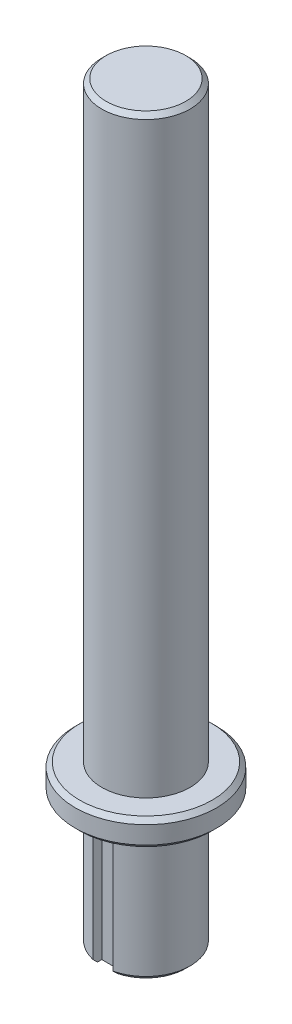
ISO-10303-21;
HEADER;
FILE_DESCRIPTION(('STEP AP214'),'2;1');
FILE_NAME('part.step','',(''),(''),'','','');
FILE_SCHEMA(('AUTOMOTIVE_DESIGN { 1 0 10303 214 1 1 1 1 }'));
ENDSEC;
DATA;
#1=APPLICATION_CONTEXT('core data for automotive mechanical design processes');
#2=APPLICATION_PROTOCOL_DEFINITION('international standard','automotive_design',2000,#1);
#3=PRODUCT_CONTEXT('',#1,'mechanical');
#4=PRODUCT('Part','Part','',(#3));
#5=PRODUCT_RELATED_PRODUCT_CATEGORY('part','',(#4));
#6=PRODUCT_DEFINITION_FORMATION('','',#4);
#7=PRODUCT_DEFINITION_CONTEXT('part definition',#1,'design');
#8=PRODUCT_DEFINITION('design','',#6,#7);
#9=PRODUCT_DEFINITION_SHAPE('','',#8);
#10=(LENGTH_UNIT() NAMED_UNIT(*) SI_UNIT(.MILLI.,.METRE.));
#11=(NAMED_UNIT(*) PLANE_ANGLE_UNIT() SI_UNIT($,.RADIAN.));
#12=(NAMED_UNIT(*) SI_UNIT($,.STERADIAN.) SOLID_ANGLE_UNIT());
#13=UNCERTAINTY_MEASURE_WITH_UNIT(LENGTH_MEASURE(1.E-05),#10,'distance_accuracy_value','');
#14=(GEOMETRIC_REPRESENTATION_CONTEXT(3) GLOBAL_UNCERTAINTY_ASSIGNED_CONTEXT((#13)) GLOBAL_UNIT_ASSIGNED_CONTEXT((#10,
#11,#12)) REPRESENTATION_CONTEXT('',''));
#15=CARTESIAN_POINT('',(0.,0.,0.));
#16=DIRECTION('',(0.,0.,1.));
#17=DIRECTION('',(1.,0.,0.));
#18=AXIS2_PLACEMENT_3D('',#15,#16,#17);
#19=CARTESIAN_POINT('',(0.,0.,0.));
#20=DIRECTION('',(0.,1.,0.));
#21=DIRECTION('',(-1.,0.,0.));
#22=AXIS2_PLACEMENT_3D('',#19,#20,#21);
#23=PLANE('',#22);
#24=DIRECTION('',(0.,0.,-1.));
#25=VECTOR('',#24,1.);
#26=CARTESIAN_POINT('',(-1.125,0.,6.12500000000001));
#27=LINE('',#26,#25);
#28=CARTESIAN_POINT('',(-1.125,0.,4.35710626448337));
#29=VERTEX_POINT('',#28);
#30=CARTESIAN_POINT('',(-1.125,0.,3.87500000000001));
#31=VERTEX_POINT('',#30);
#32=EDGE_CURVE('E102',#29,#31,#27,.T.);
#33=ORIENTED_EDGE('',*,*,#32,.F.);
#34=CARTESIAN_POINT('',(0.,0.,0.));
#35=DIRECTION('',(0.,1.,0.));
#36=DIRECTION('',(-1.,0.,0.));
#37=AXIS2_PLACEMENT_3D('',#34,#35,#36);
#38=CIRCLE('',#37,4.50000000000003);
#39=CARTESIAN_POINT('',(1.125,0.,4.35710626448337));
#40=VERTEX_POINT('',#39);
#41=EDGE_CURVE('E46',#29,#40,#38,.F.);
#42=ORIENTED_EDGE('',*,*,#41,.T.);
#43=DIRECTION('',(0.,0.,1.));
#44=VECTOR('',#43,1.);
#45=CARTESIAN_POINT('',(1.125,0.,6.12500000000001));
#46=LINE('',#45,#44);
#47=CARTESIAN_POINT('',(1.125,0.,3.87500000000001));
#48=VERTEX_POINT('',#47);
#49=EDGE_CURVE('E86',#48,#40,#46,.T.);
#50=ORIENTED_EDGE('',*,*,#49,.F.);
#51=DIRECTION('',(1.,0.,0.));
#52=VECTOR('',#51,1.);
#53=CARTESIAN_POINT('',(-1.125,0.,3.87500000000001));
#54=LINE('',#53,#52);
#55=EDGE_CURVE('E97',#31,#48,#54,.T.);
#56=ORIENTED_EDGE('',*,*,#55,.F.);
#57=EDGE_LOOP('',(#33,#42,#50,#56));
#58=FACE_BOUND('',#57,.T.);
#59=ADVANCED_FACE('F33',(#58),#23,.F.);
#60=CARTESIAN_POINT('',(0.,85.,0.));
#61=DIRECTION('',(0.,1.,0.));
#62=DIRECTION('',(-1.,0.,0.));
#63=AXIS2_PLACEMENT_3D('',#60,#61,#62);
#64=CYLINDRICAL_SURFACE('',#63,5.00000000000001);
#65=DIRECTION('',(0.,1.,0.));
#66=VECTOR('',#65,1.);
#67=CARTESIAN_POINT('',(1.12499999999999,85.,4.87179381747628));
#68=LINE('',#67,#66);
#69=CARTESIAN_POINT('',(1.125,15.,4.87179381747628));
#70=VERTEX_POINT('',#69);
#71=CARTESIAN_POINT('',(1.12499999999999,0.499999999999987,4.87179381747628));
#72=VERTEX_POINT('',#71);
#73=EDGE_CURVE('E108',#70,#72,#68,.F.);
#74=ORIENTED_EDGE('',*,*,#73,.T.);
#75=CARTESIAN_POINT('',(0.,0.499999999999987,0.));
#76=DIRECTION('',(0.,1.,0.));
#77=DIRECTION('',(-1.,0.,0.));
#78=AXIS2_PLACEMENT_3D('',#75,#76,#77);
#79=CIRCLE('',#78,5.00000000000001);
#80=CARTESIAN_POINT('',(-1.12500000000001,0.499999999999987,4.87179381747628));
#81=VERTEX_POINT('',#80);
#82=EDGE_CURVE('E140',#72,#81,#79,.T.);
#83=ORIENTED_EDGE('',*,*,#82,.T.);
#84=DIRECTION('',(0.,1.,0.));
#85=VECTOR('',#84,1.);
#86=CARTESIAN_POINT('',(-1.12500000000001,85.,4.87179381747628));
#87=LINE('',#86,#85);
#88=CARTESIAN_POINT('',(-1.125,15.,4.87179381747628));
#89=VERTEX_POINT('',#88);
#90=EDGE_CURVE('E114',#81,#89,#87,.T.);
#91=ORIENTED_EDGE('',*,*,#90,.T.);
#92=CARTESIAN_POINT('',(0.,15.,0.));
#93=DIRECTION('',(0.,1.,0.));
#94=DIRECTION('',(-1.,0.,0.));
#95=AXIS2_PLACEMENT_3D('',#92,#93,#94);
#96=CIRCLE('',#95,5.00000000000001);
#97=EDGE_CURVE('E119',#70,#89,#96,.T.);
#98=ORIENTED_EDGE('',*,*,#97,.F.);
#99=EDGE_LOOP('',(#74,#83,#91,#98));
#100=FACE_BOUND('',#99,.T.);
#101=ADVANCED_FACE('F171',(#100),#64,.T.);
#102=CARTESIAN_POINT('',(8.,15.,0.));
#103=DIRECTION('',(0.,1.,0.));
#104=DIRECTION('',(-1.,0.,0.));
#105=AXIS2_PLACEMENT_3D('',#102,#103,#104);
#106=PLANE('',#105);
#107=CARTESIAN_POINT('',(0.,15.,0.));
#108=DIRECTION('',(0.,1.,0.));
#109=DIRECTION('',(-1.,0.,0.));
#110=AXIS2_PLACEMENT_3D('',#107,#108,#109);
#111=CIRCLE('',#110,7.50000000000001);
#112=CARTESIAN_POINT('',(-7.50000000000001,15.,0.));
#113=VERTEX_POINT('',#112);
#114=EDGE_CURVE('E128',#113,#113,#111,.F.);
#115=ORIENTED_EDGE('',*,*,#114,.T.);
#116=EDGE_LOOP('',(#115));
#117=FACE_BOUND('',#116,.T.);
#118=ORIENTED_EDGE('',*,*,#97,.T.);
#119=DIRECTION('',(0.,0.,-1.));
#120=VECTOR('',#119,1.);
#121=CARTESIAN_POINT('',(-1.125,15.,6.12500000000001));
#122=LINE('',#121,#120);
#123=CARTESIAN_POINT('',(-1.125,15.,3.87500000000001));
#124=VERTEX_POINT('',#123);
#125=EDGE_CURVE('E101',#89,#124,#122,.T.);
#126=ORIENTED_EDGE('',*,*,#125,.T.);
#127=DIRECTION('',(1.,0.,0.));
#128=VECTOR('',#127,1.);
#129=CARTESIAN_POINT('',(-1.125,15.,3.87500000000001));
#130=LINE('',#129,#128);
#131=CARTESIAN_POINT('',(1.125,15.,3.87500000000001));
#132=VERTEX_POINT('',#131);
#133=EDGE_CURVE('E93',#124,#132,#130,.T.);
#134=ORIENTED_EDGE('',*,*,#133,.T.);
#135=DIRECTION('',(0.,0.,1.));
#136=VECTOR('',#135,1.);
#137=CARTESIAN_POINT('',(1.125,15.,6.12500000000001));
#138=LINE('',#137,#136);
#139=EDGE_CURVE('E89',#132,#70,#138,.T.);
#140=ORIENTED_EDGE('',*,*,#139,.T.);
#141=EDGE_LOOP('',(#118,#126,#134,#140));
#142=FACE_BOUND('',#141,.T.);
#143=ADVANCED_FACE('F167',(#117,#142),#106,.F.);
#144=CARTESIAN_POINT('',(0.,85.,0.));
#145=DIRECTION('',(0.,1.,0.));
#146=DIRECTION('',(-1.,0.,0.));
#147=AXIS2_PLACEMENT_3D('',#144,#145,#146);
#148=CYLINDRICAL_SURFACE('',#147,8.);
#149=CARTESIAN_POINT('',(0.,15.5,0.));
#150=DIRECTION('',(0.,1.,0.));
#151=DIRECTION('',(-1.,0.,0.));
#152=AXIS2_PLACEMENT_3D('',#149,#150,#151);
#153=CIRCLE('',#152,8.);
#154=CARTESIAN_POINT('',(-8.,15.5,0.));
#155=VERTEX_POINT('',#154);
#156=EDGE_CURVE('E125',#155,#155,#153,.T.);
#157=ORIENTED_EDGE('',*,*,#156,.T.);
#158=EDGE_LOOP('',(#157));
#159=FACE_BOUND('',#158,.T.);
#160=CARTESIAN_POINT('',(0.,17.5,0.));
#161=DIRECTION('',(0.,-1.,0.));
#162=DIRECTION('',(1.,0.,0.));
#163=AXIS2_PLACEMENT_3D('',#160,#161,#162);
#164=CIRCLE('',#163,8.);
#165=CARTESIAN_POINT('',(8.,17.5,0.));
#166=VERTEX_POINT('',#165);
#167=EDGE_CURVE('E122',#166,#166,#164,.T.);
#168=ORIENTED_EDGE('',*,*,#167,.T.);
#169=EDGE_LOOP('',(#168));
#170=FACE_BOUND('',#169,.T.);
#171=ADVANCED_FACE('F163',(#159,#170),#148,.T.);
#172=CARTESIAN_POINT('',(5.00000000000001,18.,0.));
#173=DIRECTION('',(0.,-1.,0.));
#174=DIRECTION('',(1.,0.,0.));
#175=AXIS2_PLACEMENT_3D('',#172,#173,#174);
#176=PLANE('',#175);
#177=CARTESIAN_POINT('',(0.,18.,0.));
#178=DIRECTION('',(0.,-1.,0.));
#179=DIRECTION('',(1.,0.,0.));
#180=AXIS2_PLACEMENT_3D('',#177,#178,#179);
#181=CIRCLE('',#180,7.50000000000002);
#182=CARTESIAN_POINT('',(7.50000000000002,18.,0.));
#183=VERTEX_POINT('',#182);
#184=EDGE_CURVE('E131',#183,#183,#181,.F.);
#185=ORIENTED_EDGE('',*,*,#184,.T.);
#186=EDGE_LOOP('',(#185));
#187=FACE_BOUND('',#186,.T.);
#188=CARTESIAN_POINT('',(0.,18.,0.));
#189=DIRECTION('',(0.,1.,0.));
#190=DIRECTION('',(-1.,0.,0.));
#191=AXIS2_PLACEMENT_3D('',#188,#189,#190);
#192=CIRCLE('',#191,5.00000000000001);
#193=CARTESIAN_POINT('',(-5.00000000000001,18.,0.));
#194=VERTEX_POINT('',#193);
#195=EDGE_CURVE('E116',#194,#194,#192,.T.);
#196=ORIENTED_EDGE('',*,*,#195,.F.);
#197=EDGE_LOOP('',(#196));
#198=FACE_BOUND('',#197,.T.);
#199=ADVANCED_FACE('F159',(#187,#198),#176,.F.);
#200=CARTESIAN_POINT('',(0.,85.,0.));
#201=DIRECTION('',(0.,1.,0.));
#202=DIRECTION('',(-1.,0.,0.));
#203=AXIS2_PLACEMENT_3D('',#200,#201,#202);
#204=CYLINDRICAL_SURFACE('',#203,5.00000000000001);
#205=CARTESIAN_POINT('',(0.,84.5,0.));
#206=DIRECTION('',(0.,-1.,0.));
#207=DIRECTION('',(1.,0.,0.));
#208=AXIS2_PLACEMENT_3D('',#205,#206,#207);
#209=CIRCLE('',#208,5.00000000000001);
#210=CARTESIAN_POINT('',(5.00000000000001,84.5,0.));
#211=VERTEX_POINT('',#210);
#212=EDGE_CURVE('E137',#211,#211,#209,.T.);
#213=ORIENTED_EDGE('',*,*,#212,.T.);
#214=EDGE_LOOP('',(#213));
#215=FACE_BOUND('',#214,.T.);
#216=ORIENTED_EDGE('',*,*,#195,.T.);
#217=EDGE_LOOP('',(#216));
#218=FACE_BOUND('',#217,.T.);
#219=ADVANCED_FACE('F155',(#215,#218),#204,.T.);
#220=CARTESIAN_POINT('',(5.00000000000001,85.,0.));
#221=DIRECTION('',(0.,-1.,0.));
#222=DIRECTION('',(1.,0.,0.));
#223=AXIS2_PLACEMENT_3D('',#220,#221,#222);
#224=PLANE('',#223);
#225=CARTESIAN_POINT('',(0.,85.,0.));
#226=DIRECTION('',(0.,-1.,0.));
#227=DIRECTION('',(1.,0.,0.));
#228=AXIS2_PLACEMENT_3D('',#225,#226,#227);
#229=CIRCLE('',#228,4.50000000000002);
#230=CARTESIAN_POINT('',(4.50000000000002,85.,0.));
#231=VERTEX_POINT('',#230);
#232=EDGE_CURVE('E134',#231,#231,#229,.F.);
#233=ORIENTED_EDGE('',*,*,#232,.T.);
#234=EDGE_LOOP('',(#233));
#235=FACE_BOUND('',#234,.T.);
#236=ADVANCED_FACE('F152',(#235),#224,.F.);
#237=CARTESIAN_POINT('',(-1.125,18.1819805153395,6.12500000000001));
#238=DIRECTION('',(-1.,0.,0.));
#239=DIRECTION('',(0.,-1.,0.));
#240=AXIS2_PLACEMENT_3D('',#237,#238,#239);
#241=PLANE('',#240);
#242=ORIENTED_EDGE('',*,*,#90,.F.);
#243=CARTESIAN_POINT('',(-1.12500000000001,0.499999999999987,4.87179381747628));
#244=CARTESIAN_POINT('',(-1.125,0.416532154862873,4.78614323730215));
#245=CARTESIAN_POINT('',(-1.125,0.333131566973705,4.70042731918897));
#246=CARTESIAN_POINT('',(-1.125,0.166464900298338,4.52886480153312));
#247=CARTESIAN_POINT('',(-1.125,0.0831988215208435,4.443018201982));
#248=CARTESIAN_POINT('',(-1.125,0.,4.35710626448337));
#249=B_SPLINE_CURVE_WITH_KNOTS('',3,(#243,#244,#245,#246,#247,#248),.UNSPECIFIED.,.F.,.F.,(4,2,
4),(0.,0.358783904466479,0.717567832151684),.UNSPECIFIED.);
#250=EDGE_CURVE('E60',#81,#29,#249,.T.);
#251=ORIENTED_EDGE('',*,*,#250,.T.);
#252=ORIENTED_EDGE('',*,*,#32,.T.);
#253=DIRECTION('',(0.,-1.,0.));
#254=VECTOR('',#253,1.);
#255=CARTESIAN_POINT('',(-1.125,18.1819805153395,3.87500000000001));
#256=LINE('',#255,#254);
#257=EDGE_CURVE('E100',#124,#31,#256,.T.);
#258=ORIENTED_EDGE('',*,*,#257,.F.);
#259=ORIENTED_EDGE('',*,*,#125,.F.);
#260=EDGE_LOOP('',(#242,#251,#252,#258,#259));
#261=FACE_BOUND('',#260,.T.);
#262=ADVANCED_FACE('F147',(#261),#241,.F.);
#263=CARTESIAN_POINT('',(1.125,18.1819805153395,6.12500000000001));
#264=DIRECTION('',(1.,0.,0.));
#265=DIRECTION('',(0.,0.,-1.));
#266=AXIS2_PLACEMENT_3D('',#263,#264,#265);
#267=PLANE('',#266);
#268=ORIENTED_EDGE('',*,*,#49,.T.);
#269=CARTESIAN_POINT('',(1.125,0.,4.35710626448337));
#270=CARTESIAN_POINT('',(1.125,0.0831988215208438,4.443018201982));
#271=CARTESIAN_POINT('',(1.125,0.166464900298338,4.52886480153312));
#272=CARTESIAN_POINT('',(1.125,0.333131566973706,4.70042731918897));
#273=CARTESIAN_POINT('',(1.125,0.416532154862874,4.78614323730216));
#274=CARTESIAN_POINT('',(1.125,0.499999999999988,4.87179381747628));
#275=B_SPLINE_CURVE_WITH_KNOTS('',3,(#269,#270,#271,#272,#273,#274),.UNSPECIFIED.,.F.,.F.,(4,2,
4),(0.,0.358783927685206,0.717567832151687),.UNSPECIFIED.);
#276=EDGE_CURVE('E11',#40,#72,#275,.T.);
#277=ORIENTED_EDGE('',*,*,#276,.T.);
#278=ORIENTED_EDGE('',*,*,#73,.F.);
#279=ORIENTED_EDGE('',*,*,#139,.F.);
#280=DIRECTION('',(0.,-1.,0.));
#281=VECTOR('',#280,1.);
#282=CARTESIAN_POINT('',(1.125,18.1819805153395,3.87500000000001));
#283=LINE('',#282,#281);
#284=EDGE_CURVE('E83',#132,#48,#283,.T.);
#285=ORIENTED_EDGE('',*,*,#284,.T.);
#286=EDGE_LOOP('',(#268,#277,#278,#279,#285));
#287=FACE_BOUND('',#286,.T.);
#288=ADVANCED_FACE('F85',(#287),#267,.F.);
#289=CARTESIAN_POINT('',(-1.125,18.1819805153395,3.87500000000001));
#290=DIRECTION('',(0.,0.,-1.));
#291=DIRECTION('',(-1.,0.,0.));
#292=AXIS2_PLACEMENT_3D('',#289,#290,#291);
#293=PLANE('',#292);
#294=ORIENTED_EDGE('',*,*,#257,.T.);
#295=ORIENTED_EDGE('',*,*,#55,.T.);
#296=ORIENTED_EDGE('',*,*,#284,.F.);
#297=ORIENTED_EDGE('',*,*,#133,.F.);
#298=EDGE_LOOP('',(#294,#295,#296,#297));
#299=FACE_BOUND('',#298,.T.);
#300=ADVANCED_FACE('F98',(#299),#293,.F.);
#301=CARTESIAN_POINT('',(0.,15.5,0.));
#302=DIRECTION('',(0.,1.,0.));
#303=DIRECTION('',(-1.,0.,0.));
#304=AXIS2_PLACEMENT_3D('',#301,#302,#303);
#305=CONICAL_SURFACE('',#304,8.,0.78539816339744);
#306=ORIENTED_EDGE('',*,*,#114,.F.);
#307=EDGE_LOOP('',(#306));
#308=FACE_BOUND('',#307,.T.);
#309=ORIENTED_EDGE('',*,*,#156,.F.);
#310=EDGE_LOOP('',(#309));
#311=FACE_BOUND('',#310,.T.);
#312=ADVANCED_FACE('F178',(#308,#311),#305,.T.);
#313=CARTESIAN_POINT('',(0.,18.,0.));
#314=DIRECTION('',(0.,-1.,0.));
#315=DIRECTION('',(1.,0.,0.));
#316=AXIS2_PLACEMENT_3D('',#313,#314,#315);
#317=CONICAL_SURFACE('',#316,7.50000000000002,0.785398163397453);
#318=ORIENTED_EDGE('',*,*,#167,.F.);
#319=EDGE_LOOP('',(#318));
#320=FACE_BOUND('',#319,.T.);
#321=ORIENTED_EDGE('',*,*,#184,.F.);
#322=EDGE_LOOP('',(#321));
#323=FACE_BOUND('',#322,.T.);
#324=ADVANCED_FACE('F181',(#320,#323),#317,.T.);
#325=CARTESIAN_POINT('',(0.,85.,0.));
#326=DIRECTION('',(0.,-1.,0.));
#327=DIRECTION('',(1.,0.,0.));
#328=AXIS2_PLACEMENT_3D('',#325,#326,#327);
#329=CONICAL_SURFACE('',#328,4.50000000000002,0.78539816339744);
#330=ORIENTED_EDGE('',*,*,#212,.F.);
#331=EDGE_LOOP('',(#330));
#332=FACE_BOUND('',#331,.T.);
#333=ORIENTED_EDGE('',*,*,#232,.F.);
#334=EDGE_LOOP('',(#333));
#335=FACE_BOUND('',#334,.T.);
#336=ADVANCED_FACE('F184',(#332,#335),#329,.T.);
#337=CARTESIAN_POINT('',(0.,0.499999999999987,0.));
#338=DIRECTION('',(0.,1.,0.));
#339=DIRECTION('',(-1.,0.,0.));
#340=AXIS2_PLACEMENT_3D('',#337,#338,#339);
#341=CONICAL_SURFACE('',#340,5.00000000000001,0.785398163397448);
#342=ORIENTED_EDGE('',*,*,#276,.F.);
#343=ORIENTED_EDGE('',*,*,#41,.F.);
#344=ORIENTED_EDGE('',*,*,#250,.F.);
#345=ORIENTED_EDGE('',*,*,#82,.F.);
#346=EDGE_LOOP('',(#342,#343,#344,#345));
#347=FACE_BOUND('',#346,.T.);
#348=ADVANCED_FACE('F35',(#347),#341,.T.);
#349=CLOSED_SHELL('',(#59,#101,#143,#171,#199,#219,#236,#262,#288,#300,#312,#324,#336,#348));
#350=MANIFOLD_SOLID_BREP('B2',#349);
#351=ADVANCED_BREP_SHAPE_REPRESENTATION('',(#18,#350),#14);
#352=SHAPE_DEFINITION_REPRESENTATION(#9,#351);
ENDSEC;
END-ISO-10303-21;
